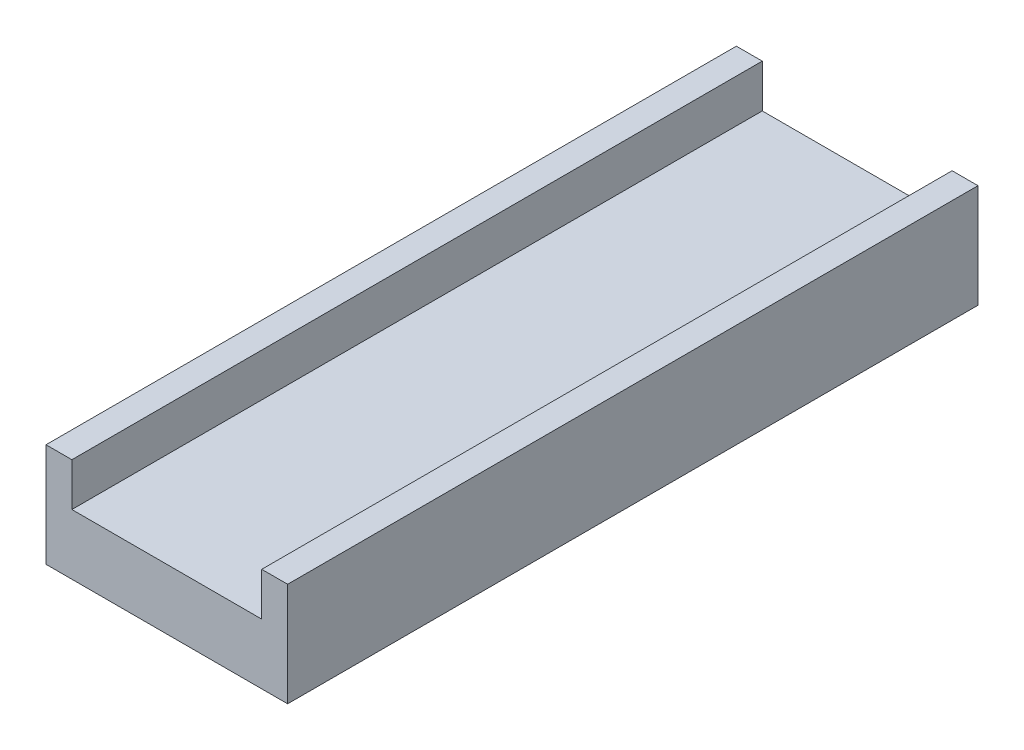
ISO-10303-21;
HEADER;
FILE_DESCRIPTION(('STEP AP214'),'2;1');
FILE_NAME('part.step','',(''),(''),'','','');
FILE_SCHEMA(('AUTOMOTIVE_DESIGN { 1 0 10303 214 1 1 1 1 }'));
ENDSEC;
DATA;
#1=APPLICATION_CONTEXT('core data for automotive mechanical design processes');
#2=APPLICATION_PROTOCOL_DEFINITION('international standard','automotive_design',2000,#1);
#3=PRODUCT_CONTEXT('',#1,'mechanical');
#4=PRODUCT('Part','Part','',(#3));
#5=PRODUCT_RELATED_PRODUCT_CATEGORY('part','',(#4));
#6=PRODUCT_DEFINITION_FORMATION('','',#4);
#7=PRODUCT_DEFINITION_CONTEXT('part definition',#1,'design');
#8=PRODUCT_DEFINITION('design','',#6,#7);
#9=PRODUCT_DEFINITION_SHAPE('','',#8);
#10=(LENGTH_UNIT() NAMED_UNIT(*) SI_UNIT(.MILLI.,.METRE.));
#11=(NAMED_UNIT(*) PLANE_ANGLE_UNIT() SI_UNIT($,.RADIAN.));
#12=(NAMED_UNIT(*) SI_UNIT($,.STERADIAN.) SOLID_ANGLE_UNIT());
#13=UNCERTAINTY_MEASURE_WITH_UNIT(LENGTH_MEASURE(1.E-05),#10,'distance_accuracy_value','');
#14=(GEOMETRIC_REPRESENTATION_CONTEXT(3) GLOBAL_UNCERTAINTY_ASSIGNED_CONTEXT((#13)) GLOBAL_UNIT_ASSIGNED_CONTEXT((#10,
#11,#12)) REPRESENTATION_CONTEXT('',''));
#15=CARTESIAN_POINT('',(0.,0.,0.));
#16=DIRECTION('',(0.,0.,1.));
#17=DIRECTION('',(1.,0.,0.));
#18=AXIS2_PLACEMENT_3D('',#15,#16,#17);
#19=CARTESIAN_POINT('',(0.,12.,0.));
#20=DIRECTION('',(0.,-1.,0.));
#21=DIRECTION('',(0.,0.,-1.));
#22=AXIS2_PLACEMENT_3D('',#19,#20,#21);
#23=PLANE('',#22);
#24=DIRECTION('',(0.,0.,1.));
#25=VECTOR('',#24,1.);
#26=CARTESIAN_POINT('',(-11.,12.,-40.));
#27=LINE('',#26,#25);
#28=CARTESIAN_POINT('',(-11.,12.,-40.));
#29=VERTEX_POINT('',#28);
#30=CARTESIAN_POINT('',(-11.,12.,40.));
#31=VERTEX_POINT('',#30);
#32=EDGE_CURVE('E129',#29,#31,#27,.T.);
#33=ORIENTED_EDGE('',*,*,#32,.F.);
#34=DIRECTION('',(-1.,0.,0.));
#35=VECTOR('',#34,1.);
#36=CARTESIAN_POINT('',(14.,12.,-40.));
#37=LINE('',#36,#35);
#38=CARTESIAN_POINT('',(-14.,12.,-40.));
#39=VERTEX_POINT('',#38);
#40=EDGE_CURVE('E141',#29,#39,#37,.T.);
#41=ORIENTED_EDGE('',*,*,#40,.T.);
#42=DIRECTION('',(0.,0.,1.));
#43=VECTOR('',#42,1.);
#44=CARTESIAN_POINT('',(-14.,12.,-40.));
#45=LINE('',#44,#43);
#46=CARTESIAN_POINT('',(-14.,12.,40.));
#47=VERTEX_POINT('',#46);
#48=EDGE_CURVE('E148',#39,#47,#45,.T.);
#49=ORIENTED_EDGE('',*,*,#48,.T.);
#50=DIRECTION('',(1.,0.,0.));
#51=VECTOR('',#50,1.);
#52=CARTESIAN_POINT('',(14.,12.,40.));
#53=LINE('',#52,#51);
#54=EDGE_CURVE('E147',#47,#31,#53,.T.);
#55=ORIENTED_EDGE('',*,*,#54,.T.);
#56=EDGE_LOOP('',(#33,#41,#49,#55));
#57=FACE_BOUND('',#56,.T.);
#58=ADVANCED_FACE('F39',(#57),#23,.F.);
#59=CARTESIAN_POINT('',(14.,2.,-40.));
#60=DIRECTION('',(-1.,0.,0.));
#61=DIRECTION('',(0.,0.,1.));
#62=AXIS2_PLACEMENT_3D('',#59,#60,#61);
#63=PLANE('',#62);
#64=DIRECTION('',(0.,0.,-1.));
#65=VECTOR('',#64,1.);
#66=CARTESIAN_POINT('',(14.,0.,-40.));
#67=LINE('',#66,#65);
#68=CARTESIAN_POINT('',(14.,0.,40.));
#69=VERTEX_POINT('',#68);
#70=CARTESIAN_POINT('',(14.,0.,-40.));
#71=VERTEX_POINT('',#70);
#72=EDGE_CURVE('E153',#69,#71,#67,.T.);
#73=ORIENTED_EDGE('',*,*,#72,.T.);
#74=DIRECTION('',(0.,-1.,0.));
#75=VECTOR('',#74,1.);
#76=CARTESIAN_POINT('',(14.,2.,-40.));
#77=LINE('',#76,#75);
#78=CARTESIAN_POINT('',(14.,12.,-40.));
#79=VERTEX_POINT('',#78);
#80=EDGE_CURVE('E11',#79,#71,#77,.T.);
#81=ORIENTED_EDGE('',*,*,#80,.F.);
#82=DIRECTION('',(0.,0.,-1.));
#83=VECTOR('',#82,1.);
#84=CARTESIAN_POINT('',(14.,12.,-40.));
#85=LINE('',#84,#83);
#86=CARTESIAN_POINT('',(14.,12.,40.));
#87=VERTEX_POINT('',#86);
#88=EDGE_CURVE('E122',#87,#79,#85,.T.);
#89=ORIENTED_EDGE('',*,*,#88,.F.);
#90=DIRECTION('',(0.,-1.,0.));
#91=VECTOR('',#90,1.);
#92=CARTESIAN_POINT('',(14.,2.,40.));
#93=LINE('',#92,#91);
#94=EDGE_CURVE('E161',#87,#69,#93,.T.);
#95=ORIENTED_EDGE('',*,*,#94,.T.);
#96=EDGE_LOOP('',(#73,#81,#89,#95));
#97=FACE_BOUND('',#96,.T.);
#98=ADVANCED_FACE('F41',(#97),#63,.F.);
#99=CARTESIAN_POINT('',(-14.,2.,-40.));
#100=DIRECTION('',(0.,0.,1.));
#101=DIRECTION('',(1.,0.,0.));
#102=AXIS2_PLACEMENT_3D('',#99,#100,#101);
#103=PLANE('',#102);
#104=DIRECTION('',(1.,0.,0.));
#105=VECTOR('',#104,1.);
#106=CARTESIAN_POINT('',(-11.,7.,-40.));
#107=LINE('',#106,#105);
#108=CARTESIAN_POINT('',(-11.,7.,-40.));
#109=VERTEX_POINT('',#108);
#110=CARTESIAN_POINT('',(11.,7.,-40.));
#111=VERTEX_POINT('',#110);
#112=EDGE_CURVE('E107',#109,#111,#107,.T.);
#113=ORIENTED_EDGE('',*,*,#112,.T.);
#114=DIRECTION('',(0.,1.,0.));
#115=VECTOR('',#114,1.);
#116=CARTESIAN_POINT('',(11.,7.,-40.));
#117=LINE('',#116,#115);
#118=CARTESIAN_POINT('',(11.,12.,-40.));
#119=VERTEX_POINT('',#118);
#120=EDGE_CURVE('E113',#111,#119,#117,.T.);
#121=ORIENTED_EDGE('',*,*,#120,.T.);
#122=EDGE_CURVE('E145',#79,#119,#37,.T.);
#123=ORIENTED_EDGE('',*,*,#122,.F.);
#124=ORIENTED_EDGE('',*,*,#80,.T.);
#125=DIRECTION('',(-1.,0.,0.));
#126=VECTOR('',#125,1.);
#127=CARTESIAN_POINT('',(-14.,0.,-40.));
#128=LINE('',#127,#126);
#129=CARTESIAN_POINT('',(-14.,0.,-40.));
#130=VERTEX_POINT('',#129);
#131=EDGE_CURVE('E156',#71,#130,#128,.T.);
#132=ORIENTED_EDGE('',*,*,#131,.T.);
#133=DIRECTION('',(0.,-1.,0.));
#134=VECTOR('',#133,1.);
#135=CARTESIAN_POINT('',(-14.,2.,-40.));
#136=LINE('',#135,#134);
#137=EDGE_CURVE('E50',#39,#130,#136,.T.);
#138=ORIENTED_EDGE('',*,*,#137,.F.);
#139=ORIENTED_EDGE('',*,*,#40,.F.);
#140=DIRECTION('',(0.,1.,0.));
#141=VECTOR('',#140,1.);
#142=CARTESIAN_POINT('',(-11.,7.,-40.));
#143=LINE('',#142,#141);
#144=EDGE_CURVE('E126',#109,#29,#143,.T.);
#145=ORIENTED_EDGE('',*,*,#144,.F.);
#146=EDGE_LOOP('',(#113,#121,#123,#124,#132,#138,#139,#145));
#147=FACE_BOUND('',#146,.T.);
#148=ADVANCED_FACE('F127',(#147),#103,.F.);
#149=CARTESIAN_POINT('',(-14.,2.,-40.));
#150=DIRECTION('',(1.,0.,0.));
#151=DIRECTION('',(0.,0.,-1.));
#152=AXIS2_PLACEMENT_3D('',#149,#150,#151);
#153=PLANE('',#152);
#154=DIRECTION('',(0.,0.,1.));
#155=VECTOR('',#154,1.);
#156=CARTESIAN_POINT('',(-14.,0.,-40.));
#157=LINE('',#156,#155);
#158=CARTESIAN_POINT('',(-14.,0.,40.));
#159=VERTEX_POINT('',#158);
#160=EDGE_CURVE('E158',#130,#159,#157,.T.);
#161=ORIENTED_EDGE('',*,*,#160,.T.);
#162=DIRECTION('',(0.,-1.,0.));
#163=VECTOR('',#162,1.);
#164=CARTESIAN_POINT('',(-14.,2.,40.));
#165=LINE('',#164,#163);
#166=EDGE_CURVE('E162',#47,#159,#165,.T.);
#167=ORIENTED_EDGE('',*,*,#166,.F.);
#168=ORIENTED_EDGE('',*,*,#48,.F.);
#169=ORIENTED_EDGE('',*,*,#137,.T.);
#170=EDGE_LOOP('',(#161,#167,#168,#169));
#171=FACE_BOUND('',#170,.T.);
#172=ADVANCED_FACE('F166',(#171),#153,.F.);
#173=CARTESIAN_POINT('',(-14.,2.,40.));
#174=DIRECTION('',(0.,0.,-1.));
#175=DIRECTION('',(-1.,0.,0.));
#176=AXIS2_PLACEMENT_3D('',#173,#174,#175);
#177=PLANE('',#176);
#178=DIRECTION('',(1.,0.,0.));
#179=VECTOR('',#178,1.);
#180=CARTESIAN_POINT('',(-11.,7.,40.));
#181=LINE('',#180,#179);
#182=CARTESIAN_POINT('',(-11.,7.,40.));
#183=VERTEX_POINT('',#182);
#184=CARTESIAN_POINT('',(11.,7.,40.));
#185=VERTEX_POINT('',#184);
#186=EDGE_CURVE('E109',#183,#185,#181,.T.);
#187=ORIENTED_EDGE('',*,*,#186,.F.);
#188=DIRECTION('',(0.,1.,0.));
#189=VECTOR('',#188,1.);
#190=CARTESIAN_POINT('',(-11.,7.,40.));
#191=LINE('',#190,#189);
#192=EDGE_CURVE('E137',#183,#31,#191,.T.);
#193=ORIENTED_EDGE('',*,*,#192,.T.);
#194=ORIENTED_EDGE('',*,*,#54,.F.);
#195=ORIENTED_EDGE('',*,*,#166,.T.);
#196=DIRECTION('',(1.,0.,0.));
#197=VECTOR('',#196,1.);
#198=CARTESIAN_POINT('',(-14.,0.,40.));
#199=LINE('',#198,#197);
#200=EDGE_CURVE('E65',#159,#69,#199,.T.);
#201=ORIENTED_EDGE('',*,*,#200,.T.);
#202=ORIENTED_EDGE('',*,*,#94,.F.);
#203=CARTESIAN_POINT('',(11.,12.,40.));
#204=VERTEX_POINT('',#203);
#205=EDGE_CURVE('E149',#204,#87,#53,.T.);
#206=ORIENTED_EDGE('',*,*,#205,.F.);
#207=DIRECTION('',(0.,1.,0.));
#208=VECTOR('',#207,1.);
#209=CARTESIAN_POINT('',(11.,7.,40.));
#210=LINE('',#209,#208);
#211=EDGE_CURVE('E124',#185,#204,#210,.T.);
#212=ORIENTED_EDGE('',*,*,#211,.F.);
#213=EDGE_LOOP('',(#187,#193,#194,#195,#201,#202,#206,#212));
#214=FACE_BOUND('',#213,.T.);
#215=ADVANCED_FACE('F176',(#214),#177,.F.);
#216=CARTESIAN_POINT('',(0.,0.,0.));
#217=DIRECTION('',(0.,1.,0.));
#218=DIRECTION('',(0.,0.,1.));
#219=AXIS2_PLACEMENT_3D('',#216,#217,#218);
#220=PLANE('',#219);
#221=ORIENTED_EDGE('',*,*,#72,.F.);
#222=ORIENTED_EDGE('',*,*,#200,.F.);
#223=ORIENTED_EDGE('',*,*,#160,.F.);
#224=ORIENTED_EDGE('',*,*,#131,.F.);
#225=EDGE_LOOP('',(#221,#222,#223,#224));
#226=FACE_BOUND('',#225,.T.);
#227=ADVANCED_FACE('F175',(#226),#220,.F.);
#228=ORIENTED_EDGE('',*,*,#122,.T.);
#229=DIRECTION('',(0.,0.,1.));
#230=VECTOR('',#229,1.);
#231=CARTESIAN_POINT('',(11.,12.,-40.));
#232=LINE('',#231,#230);
#233=EDGE_CURVE('E116',#119,#204,#232,.T.);
#234=ORIENTED_EDGE('',*,*,#233,.T.);
#235=ORIENTED_EDGE('',*,*,#205,.T.);
#236=ORIENTED_EDGE('',*,*,#88,.T.);
#237=EDGE_LOOP('',(#228,#234,#235,#236));
#238=FACE_BOUND('',#237,.T.);
#239=ADVANCED_FACE('F179',(#238),#23,.F.);
#240=CARTESIAN_POINT('',(11.,7.,-40.));
#241=DIRECTION('',(-1.,0.,0.));
#242=DIRECTION('',(0.,0.,1.));
#243=AXIS2_PLACEMENT_3D('',#240,#241,#242);
#244=PLANE('',#243);
#245=ORIENTED_EDGE('',*,*,#233,.F.);
#246=ORIENTED_EDGE('',*,*,#120,.F.);
#247=DIRECTION('',(0.,0.,1.));
#248=VECTOR('',#247,1.);
#249=CARTESIAN_POINT('',(11.,7.,-40.));
#250=LINE('',#249,#248);
#251=EDGE_CURVE('E102',#111,#185,#250,.T.);
#252=ORIENTED_EDGE('',*,*,#251,.T.);
#253=ORIENTED_EDGE('',*,*,#211,.T.);
#254=EDGE_LOOP('',(#245,#246,#252,#253));
#255=FACE_BOUND('',#254,.T.);
#256=ADVANCED_FACE('F118',(#255),#244,.T.);
#257=CARTESIAN_POINT('',(-11.,7.,-40.));
#258=DIRECTION('',(-1.,0.,0.));
#259=DIRECTION('',(0.,0.,1.));
#260=AXIS2_PLACEMENT_3D('',#257,#258,#259);
#261=PLANE('',#260);
#262=ORIENTED_EDGE('',*,*,#32,.T.);
#263=ORIENTED_EDGE('',*,*,#192,.F.);
#264=DIRECTION('',(0.,0.,1.));
#265=VECTOR('',#264,1.);
#266=CARTESIAN_POINT('',(-11.,7.,-40.));
#267=LINE('',#266,#265);
#268=EDGE_CURVE('E53',#109,#183,#267,.T.);
#269=ORIENTED_EDGE('',*,*,#268,.F.);
#270=ORIENTED_EDGE('',*,*,#144,.T.);
#271=EDGE_LOOP('',(#262,#263,#269,#270));
#272=FACE_BOUND('',#271,.T.);
#273=ADVANCED_FACE('F183',(#272),#261,.F.);
#274=CARTESIAN_POINT('',(0.,7.,0.));
#275=DIRECTION('',(0.,-1.,0.));
#276=DIRECTION('',(0.,0.,-1.));
#277=AXIS2_PLACEMENT_3D('',#274,#275,#276);
#278=PLANE('',#277);
#279=ORIENTED_EDGE('',*,*,#112,.F.);
#280=ORIENTED_EDGE('',*,*,#268,.T.);
#281=ORIENTED_EDGE('',*,*,#186,.T.);
#282=ORIENTED_EDGE('',*,*,#251,.F.);
#283=EDGE_LOOP('',(#279,#280,#281,#282));
#284=FACE_BOUND('',#283,.T.);
#285=ADVANCED_FACE('F106',(#284),#278,.F.);
#286=CLOSED_SHELL('',(#58,#98,#148,#172,#215,#227,#239,#256,#273,#285));
#287=MANIFOLD_SOLID_BREP('B2',#286);
#288=ADVANCED_BREP_SHAPE_REPRESENTATION('',(#18,#287),#14);
#289=SHAPE_DEFINITION_REPRESENTATION(#9,#288);
ENDSEC;
END-ISO-10303-21;
